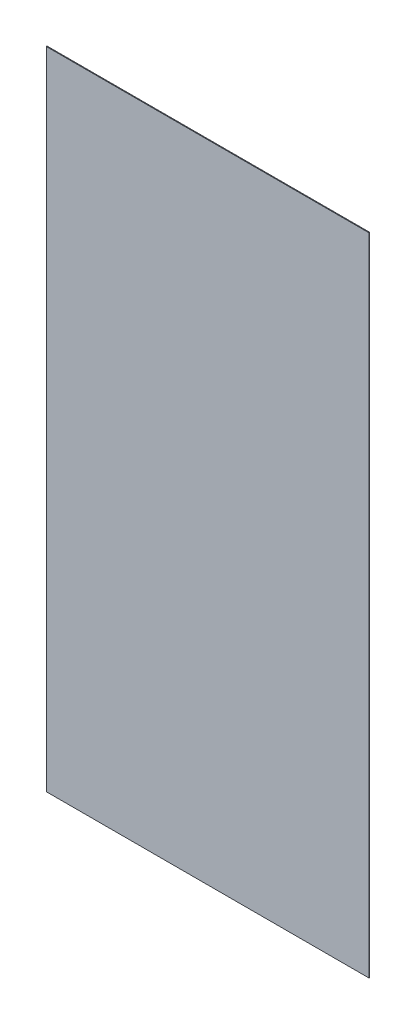
ISO-10303-21;
HEADER;
FILE_DESCRIPTION(('STEP AP214'),'2;1');
FILE_NAME('part.step','',(''),(''),'','','');
FILE_SCHEMA(('AUTOMOTIVE_DESIGN { 1 0 10303 214 1 1 1 1 }'));
ENDSEC;
DATA;
#1=APPLICATION_CONTEXT('core data for automotive mechanical design processes');
#2=APPLICATION_PROTOCOL_DEFINITION('international standard','automotive_design',2000,#1);
#3=PRODUCT_CONTEXT('',#1,'mechanical');
#4=PRODUCT('Part','Part','',(#3));
#5=PRODUCT_RELATED_PRODUCT_CATEGORY('part','',(#4));
#6=PRODUCT_DEFINITION_FORMATION('','',#4);
#7=PRODUCT_DEFINITION_CONTEXT('part definition',#1,'design');
#8=PRODUCT_DEFINITION('design','',#6,#7);
#9=PRODUCT_DEFINITION_SHAPE('','',#8);
#10=(LENGTH_UNIT() NAMED_UNIT(*) SI_UNIT(.MILLI.,.METRE.));
#11=(NAMED_UNIT(*) PLANE_ANGLE_UNIT() SI_UNIT($,.RADIAN.));
#12=(NAMED_UNIT(*) SI_UNIT($,.STERADIAN.) SOLID_ANGLE_UNIT());
#13=UNCERTAINTY_MEASURE_WITH_UNIT(LENGTH_MEASURE(1.E-05),#10,'distance_accuracy_value','');
#14=(GEOMETRIC_REPRESENTATION_CONTEXT(3) GLOBAL_UNCERTAINTY_ASSIGNED_CONTEXT((#13)) GLOBAL_UNIT_ASSIGNED_CONTEXT((#10,
#11,#12)) REPRESENTATION_CONTEXT('',''));
#15=CARTESIAN_POINT('',(0.,0.,0.));
#16=DIRECTION('',(0.,0.,1.));
#17=DIRECTION('',(1.,0.,0.));
#18=AXIS2_PLACEMENT_3D('',#15,#16,#17);
#19=CARTESIAN_POINT('',(609.6,-1219.2,3.));
#20=DIRECTION('',(-1.,0.,0.));
#21=DIRECTION('',(0.,0.,1.));
#22=AXIS2_PLACEMENT_3D('',#19,#20,#21);
#23=PLANE('',#22);
#24=DIRECTION('',(0.,1.,0.));
#25=VECTOR('',#24,1.);
#26=CARTESIAN_POINT('',(609.6,-1219.2,0.));
#27=LINE('',#26,#25);
#28=CARTESIAN_POINT('',(609.6,-1219.2,0.));
#29=VERTEX_POINT('',#28);
#30=CARTESIAN_POINT('',(609.6,1219.2,0.));
#31=VERTEX_POINT('',#30);
#32=EDGE_CURVE('E96',#29,#31,#27,.T.);
#33=ORIENTED_EDGE('',*,*,#32,.T.);
#34=DIRECTION('',(0.,0.,-1.));
#35=VECTOR('',#34,1.);
#36=CARTESIAN_POINT('',(609.6,1219.2,3.));
#37=LINE('',#36,#35);
#38=CARTESIAN_POINT('',(609.6,1219.2,3.));
#39=VERTEX_POINT('',#38);
#40=EDGE_CURVE('E11',#39,#31,#37,.T.);
#41=ORIENTED_EDGE('',*,*,#40,.F.);
#42=DIRECTION('',(0.,1.,0.));
#43=VECTOR('',#42,1.);
#44=CARTESIAN_POINT('',(609.6,-1219.2,3.));
#45=LINE('',#44,#43);
#46=CARTESIAN_POINT('',(609.6,-1219.2,3.));
#47=VERTEX_POINT('',#46);
#48=EDGE_CURVE('E84',#47,#39,#45,.T.);
#49=ORIENTED_EDGE('',*,*,#48,.F.);
#50=DIRECTION('',(0.,0.,-1.));
#51=VECTOR('',#50,1.);
#52=CARTESIAN_POINT('',(609.6,-1219.2,3.));
#53=LINE('',#52,#51);
#54=EDGE_CURVE('E92',#47,#29,#53,.T.);
#55=ORIENTED_EDGE('',*,*,#54,.T.);
#56=EDGE_LOOP('',(#33,#41,#49,#55));
#57=FACE_BOUND('',#56,.T.);
#58=ADVANCED_FACE('F33',(#57),#23,.F.);
#59=CARTESIAN_POINT('',(-609.6,1219.2,3.));
#60=DIRECTION('',(0.,-1.,0.));
#61=DIRECTION('',(0.,0.,-1.));
#62=AXIS2_PLACEMENT_3D('',#59,#60,#61);
#63=PLANE('',#62);
#64=DIRECTION('',(-1.,0.,0.));
#65=VECTOR('',#64,1.);
#66=CARTESIAN_POINT('',(-609.6,1219.2,0.));
#67=LINE('',#66,#65);
#68=CARTESIAN_POINT('',(-609.6,1219.2,0.));
#69=VERTEX_POINT('',#68);
#70=EDGE_CURVE('E88',#31,#69,#67,.T.);
#71=ORIENTED_EDGE('',*,*,#70,.T.);
#72=DIRECTION('',(0.,0.,-1.));
#73=VECTOR('',#72,1.);
#74=CARTESIAN_POINT('',(-609.6,1219.2,3.));
#75=LINE('',#74,#73);
#76=CARTESIAN_POINT('',(-609.6,1219.2,3.));
#77=VERTEX_POINT('',#76);
#78=EDGE_CURVE('E41',#77,#69,#75,.T.);
#79=ORIENTED_EDGE('',*,*,#78,.F.);
#80=DIRECTION('',(-1.,0.,0.));
#81=VECTOR('',#80,1.);
#82=CARTESIAN_POINT('',(-609.6,1219.2,3.));
#83=LINE('',#82,#81);
#84=EDGE_CURVE('E79',#39,#77,#83,.T.);
#85=ORIENTED_EDGE('',*,*,#84,.F.);
#86=ORIENTED_EDGE('',*,*,#40,.T.);
#87=EDGE_LOOP('',(#71,#79,#85,#86));
#88=FACE_BOUND('',#87,.T.);
#89=ADVANCED_FACE('F87',(#88),#63,.F.);
#90=CARTESIAN_POINT('',(-609.6,-1219.2,3.));
#91=DIRECTION('',(1.,0.,0.));
#92=DIRECTION('',(0.,0.,-1.));
#93=AXIS2_PLACEMENT_3D('',#90,#91,#92);
#94=PLANE('',#93);
#95=DIRECTION('',(0.,-1.,0.));
#96=VECTOR('',#95,1.);
#97=CARTESIAN_POINT('',(-609.6,-1219.2,0.));
#98=LINE('',#97,#96);
#99=CARTESIAN_POINT('',(-609.6,-1219.2,0.));
#100=VERTEX_POINT('',#99);
#101=EDGE_CURVE('E66',#69,#100,#98,.T.);
#102=ORIENTED_EDGE('',*,*,#101,.T.);
#103=DIRECTION('',(0.,0.,-1.));
#104=VECTOR('',#103,1.);
#105=CARTESIAN_POINT('',(-609.6,-1219.2,3.));
#106=LINE('',#105,#104);
#107=CARTESIAN_POINT('',(-609.6,-1219.2,3.));
#108=VERTEX_POINT('',#107);
#109=EDGE_CURVE('E89',#108,#100,#106,.T.);
#110=ORIENTED_EDGE('',*,*,#109,.F.);
#111=DIRECTION('',(0.,-1.,0.));
#112=VECTOR('',#111,1.);
#113=CARTESIAN_POINT('',(-609.6,-1219.2,3.));
#114=LINE('',#113,#112);
#115=EDGE_CURVE('E82',#77,#108,#114,.T.);
#116=ORIENTED_EDGE('',*,*,#115,.F.);
#117=ORIENTED_EDGE('',*,*,#78,.T.);
#118=EDGE_LOOP('',(#102,#110,#116,#117));
#119=FACE_BOUND('',#118,.T.);
#120=ADVANCED_FACE('F90',(#119),#94,.F.);
#121=CARTESIAN_POINT('',(-609.6,-1219.2,3.));
#122=DIRECTION('',(0.,1.,0.));
#123=DIRECTION('',(0.,0.,1.));
#124=AXIS2_PLACEMENT_3D('',#121,#122,#123);
#125=PLANE('',#124);
#126=DIRECTION('',(1.,0.,0.));
#127=VECTOR('',#126,1.);
#128=CARTESIAN_POINT('',(-609.6,-1219.2,0.));
#129=LINE('',#128,#127);
#130=EDGE_CURVE('E72',#100,#29,#129,.T.);
#131=ORIENTED_EDGE('',*,*,#130,.T.);
#132=ORIENTED_EDGE('',*,*,#54,.F.);
#133=DIRECTION('',(1.,0.,0.));
#134=VECTOR('',#133,1.);
#135=CARTESIAN_POINT('',(-609.6,-1219.2,3.));
#136=LINE('',#135,#134);
#137=EDGE_CURVE('E49',#108,#47,#136,.T.);
#138=ORIENTED_EDGE('',*,*,#137,.F.);
#139=ORIENTED_EDGE('',*,*,#109,.T.);
#140=EDGE_LOOP('',(#131,#132,#138,#139));
#141=FACE_BOUND('',#140,.T.);
#142=ADVANCED_FACE('F103',(#141),#125,.F.);
#143=CARTESIAN_POINT('',(0.,0.,3.));
#144=DIRECTION('',(0.,0.,-1.));
#145=DIRECTION('',(-1.,0.,0.));
#146=AXIS2_PLACEMENT_3D('',#143,#144,#145);
#147=PLANE('',#146);
#148=ORIENTED_EDGE('',*,*,#48,.T.);
#149=ORIENTED_EDGE('',*,*,#84,.T.);
#150=ORIENTED_EDGE('',*,*,#115,.T.);
#151=ORIENTED_EDGE('',*,*,#137,.T.);
#152=EDGE_LOOP('',(#148,#149,#150,#151));
#153=FACE_BOUND('',#152,.T.);
#154=ADVANCED_FACE('F80',(#153),#147,.F.);
#155=CARTESIAN_POINT('',(0.,0.,0.));
#156=DIRECTION('',(0.,0.,-1.));
#157=DIRECTION('',(-1.,0.,0.));
#158=AXIS2_PLACEMENT_3D('',#155,#156,#157);
#159=PLANE('',#158);
#160=ORIENTED_EDGE('',*,*,#32,.F.);
#161=ORIENTED_EDGE('',*,*,#130,.F.);
#162=ORIENTED_EDGE('',*,*,#101,.F.);
#163=ORIENTED_EDGE('',*,*,#70,.F.);
#164=EDGE_LOOP('',(#160,#161,#162,#163));
#165=FACE_BOUND('',#164,.T.);
#166=ADVANCED_FACE('F106',(#165),#159,.T.);
#167=CLOSED_SHELL('',(#58,#89,#120,#142,#154,#166));
#168=MANIFOLD_SOLID_BREP('B2',#167);
#169=ADVANCED_BREP_SHAPE_REPRESENTATION('',(#18,#168),#14);
#170=SHAPE_DEFINITION_REPRESENTATION(#9,#169);
ENDSEC;
END-ISO-10303-21;
